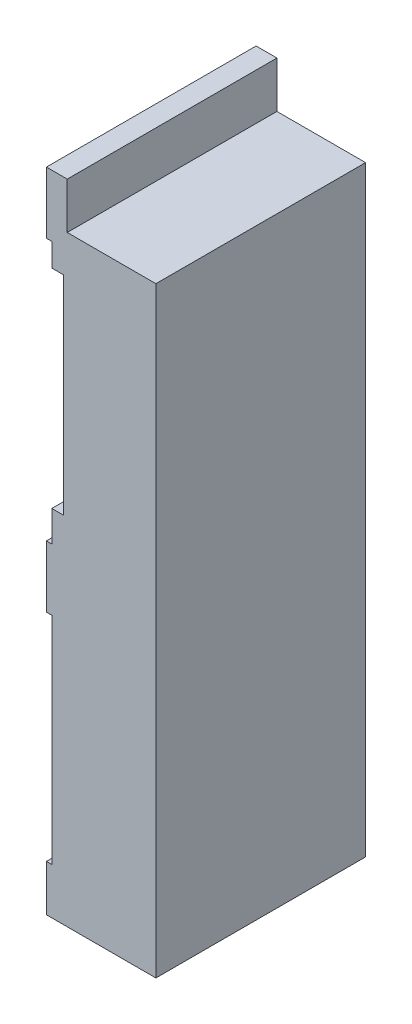
ISO-10303-21;
HEADER;
FILE_DESCRIPTION(('STEP AP214'),'2;1');
FILE_NAME('part.step','',(''),(''),'','','');
FILE_SCHEMA(('AUTOMOTIVE_DESIGN { 1 0 10303 214 1 1 1 1 }'));
ENDSEC;
DATA;
#1=APPLICATION_CONTEXT('core data for automotive mechanical design processes');
#2=APPLICATION_PROTOCOL_DEFINITION('international standard','automotive_design',2000,#1);
#3=PRODUCT_CONTEXT('',#1,'mechanical');
#4=PRODUCT('Part','Part','',(#3));
#5=PRODUCT_RELATED_PRODUCT_CATEGORY('part','',(#4));
#6=PRODUCT_DEFINITION_FORMATION('','',#4);
#7=PRODUCT_DEFINITION_CONTEXT('part definition',#1,'design');
#8=PRODUCT_DEFINITION('design','',#6,#7);
#9=PRODUCT_DEFINITION_SHAPE('','',#8);
#10=(LENGTH_UNIT() NAMED_UNIT(*) SI_UNIT(.MILLI.,.METRE.));
#11=(NAMED_UNIT(*) PLANE_ANGLE_UNIT() SI_UNIT($,.RADIAN.));
#12=(NAMED_UNIT(*) SI_UNIT($,.STERADIAN.) SOLID_ANGLE_UNIT());
#13=UNCERTAINTY_MEASURE_WITH_UNIT(LENGTH_MEASURE(1.E-05),#10,'distance_accuracy_value','');
#14=(GEOMETRIC_REPRESENTATION_CONTEXT(3) GLOBAL_UNCERTAINTY_ASSIGNED_CONTEXT((#13)) GLOBAL_UNIT_ASSIGNED_CONTEXT((#10,
#11,#12)) REPRESENTATION_CONTEXT('',''));
#15=CARTESIAN_POINT('',(0.,0.,0.));
#16=DIRECTION('',(0.,0.,1.));
#17=DIRECTION('',(1.,0.,0.));
#18=AXIS2_PLACEMENT_3D('',#15,#16,#17);
#19=CARTESIAN_POINT('',(10.2,32.,13.6));
#20=DIRECTION('',(1.,0.,0.));
#21=DIRECTION('',(0.,0.,-1.));
#22=AXIS2_PLACEMENT_3D('',#19,#20,#21);
#23=PLANE('',#22);
#24=DIRECTION('',(0.,-1.,0.));
#25=VECTOR('',#24,1.);
#26=CARTESIAN_POINT('',(10.2,32.,3.8));
#27=LINE('',#26,#25);
#28=CARTESIAN_POINT('',(10.2,18.,3.8));
#29=VERTEX_POINT('',#28);
#30=CARTESIAN_POINT('',(10.2,15.,3.8));
#31=VERTEX_POINT('',#30);
#32=EDGE_CURVE('E504',#29,#31,#27,.T.);
#33=ORIENTED_EDGE('',*,*,#32,.T.);
#34=DIRECTION('',(0.,0.,1.));
#35=VECTOR('',#34,1.);
#36=CARTESIAN_POINT('',(10.2,15.,13.6));
#37=LINE('',#36,#35);
#38=CARTESIAN_POINT('',(10.2,15.,9.8));
#39=VERTEX_POINT('',#38);
#40=EDGE_CURVE('E307',#31,#39,#37,.T.);
#41=ORIENTED_EDGE('',*,*,#40,.T.);
#42=DIRECTION('',(0.,-1.,0.));
#43=VECTOR('',#42,1.);
#44=CARTESIAN_POINT('',(10.2,32.,9.8));
#45=LINE('',#44,#43);
#46=CARTESIAN_POINT('',(10.2,18.,9.8));
#47=VERTEX_POINT('',#46);
#48=EDGE_CURVE('E46',#47,#39,#45,.T.);
#49=ORIENTED_EDGE('',*,*,#48,.F.);
#50=DIRECTION('',(0.,0.,-1.));
#51=VECTOR('',#50,1.);
#52=CARTESIAN_POINT('',(10.2,18.,13.6));
#53=LINE('',#52,#51);
#54=CARTESIAN_POINT('',(10.2,18.,13.6));
#55=VERTEX_POINT('',#54);
#56=EDGE_CURVE('E299',#55,#47,#53,.T.);
#57=ORIENTED_EDGE('',*,*,#56,.F.);
#58=DIRECTION('',(0.,-1.,0.));
#59=VECTOR('',#58,1.);
#60=CARTESIAN_POINT('',(10.2,32.,13.6));
#61=LINE('',#60,#59);
#62=CARTESIAN_POINT('',(10.2,32.,13.6));
#63=VERTEX_POINT('',#62);
#64=EDGE_CURVE('E392',#63,#55,#61,.T.);
#65=ORIENTED_EDGE('',*,*,#64,.F.);
#66=DIRECTION('',(0.,0.,-1.));
#67=VECTOR('',#66,1.);
#68=CARTESIAN_POINT('',(10.2,32.,13.6));
#69=LINE('',#68,#67);
#70=CARTESIAN_POINT('',(10.2,32.,9.8));
#71=VERTEX_POINT('',#70);
#72=EDGE_CURVE('E453',#63,#71,#69,.T.);
#73=ORIENTED_EDGE('',*,*,#72,.T.);
#74=DIRECTION('',(0.,-1.,0.));
#75=VECTOR('',#74,1.);
#76=CARTESIAN_POINT('',(10.2,32.,9.8));
#77=LINE('',#76,#75);
#78=CARTESIAN_POINT('',(10.2,31.,9.8));
#79=VERTEX_POINT('',#78);
#80=EDGE_CURVE('E348',#71,#79,#77,.T.);
#81=ORIENTED_EDGE('',*,*,#80,.T.);
#82=DIRECTION('',(0.,0.,-1.));
#83=VECTOR('',#82,1.);
#84=CARTESIAN_POINT('',(10.2,31.,13.6));
#85=LINE('',#84,#83);
#86=CARTESIAN_POINT('',(10.2,31.,3.8));
#87=VERTEX_POINT('',#86);
#88=EDGE_CURVE('E498',#79,#87,#85,.T.);
#89=ORIENTED_EDGE('',*,*,#88,.T.);
#90=DIRECTION('',(0.,-1.,0.));
#91=VECTOR('',#90,1.);
#92=CARTESIAN_POINT('',(10.2,32.,3.8));
#93=LINE('',#92,#91);
#94=CARTESIAN_POINT('',(10.2,32.,3.8));
#95=VERTEX_POINT('',#94);
#96=EDGE_CURVE('E357',#95,#87,#93,.T.);
#97=ORIENTED_EDGE('',*,*,#96,.F.);
#98=CARTESIAN_POINT('',(10.2,32.,0.));
#99=VERTEX_POINT('',#98);
#100=EDGE_CURVE('E421',#95,#99,#69,.T.);
#101=ORIENTED_EDGE('',*,*,#100,.T.);
#102=DIRECTION('',(0.,-1.,0.));
#103=VECTOR('',#102,1.);
#104=CARTESIAN_POINT('',(10.2,32.,0.));
#105=LINE('',#104,#103);
#106=CARTESIAN_POINT('',(10.2,18.,0.));
#107=VERTEX_POINT('',#106);
#108=EDGE_CURVE('E391',#99,#107,#105,.T.);
#109=ORIENTED_EDGE('',*,*,#108,.T.);
#110=DIRECTION('',(0.,0.,-1.));
#111=VECTOR('',#110,1.);
#112=CARTESIAN_POINT('',(10.2,18.,13.6));
#113=LINE('',#112,#111);
#114=EDGE_CURVE('E318',#29,#107,#113,.T.);
#115=ORIENTED_EDGE('',*,*,#114,.F.);
#116=EDGE_LOOP('',(#33,#41,#49,#57,#65,#73,#81,#89,#97,#101,#109,#115));
#117=FACE_BOUND('',#116,.T.);
#118=ADVANCED_FACE('F39',(#117),#23,.F.);
#119=CARTESIAN_POINT('',(10.2,38.,13.6));
#120=DIRECTION('',(1.,0.,0.));
#121=DIRECTION('',(0.,0.,-1.));
#122=AXIS2_PLACEMENT_3D('',#119,#120,#121);
#123=PLANE('',#122);
#124=DIRECTION('',(0.,-1.,0.));
#125=VECTOR('',#124,1.);
#126=CARTESIAN_POINT('',(10.2,38.,3.8));
#127=LINE('',#126,#125);
#128=CARTESIAN_POINT('',(10.2,36.2,3.8));
#129=VERTEX_POINT('',#128);
#130=CARTESIAN_POINT('',(10.2,36.,3.8));
#131=VERTEX_POINT('',#130);
#132=EDGE_CURVE('E359',#129,#131,#127,.T.);
#133=ORIENTED_EDGE('',*,*,#132,.F.);
#134=DIRECTION('',(0.,0.,1.));
#135=VECTOR('',#134,1.);
#136=CARTESIAN_POINT('',(10.2,36.2,13.6));
#137=LINE('',#136,#135);
#138=CARTESIAN_POINT('',(10.2,36.2,9.8));
#139=VERTEX_POINT('',#138);
#140=EDGE_CURVE('E501',#129,#139,#137,.T.);
#141=ORIENTED_EDGE('',*,*,#140,.T.);
#142=DIRECTION('',(0.,-1.,0.));
#143=VECTOR('',#142,1.);
#144=CARTESIAN_POINT('',(10.2,38.,9.8));
#145=LINE('',#144,#143);
#146=CARTESIAN_POINT('',(10.2,36.,9.8));
#147=VERTEX_POINT('',#146);
#148=EDGE_CURVE('E351',#139,#147,#145,.T.);
#149=ORIENTED_EDGE('',*,*,#148,.T.);
#150=DIRECTION('',(0.,0.,-1.));
#151=VECTOR('',#150,1.);
#152=CARTESIAN_POINT('',(10.2,36.,13.6));
#153=LINE('',#152,#151);
#154=CARTESIAN_POINT('',(10.2,36.,13.6));
#155=VERTEX_POINT('',#154);
#156=EDGE_CURVE('E457',#155,#147,#153,.T.);
#157=ORIENTED_EDGE('',*,*,#156,.F.);
#158=DIRECTION('',(0.,-1.,0.));
#159=VECTOR('',#158,1.);
#160=CARTESIAN_POINT('',(10.2,38.,13.6));
#161=LINE('',#160,#159);
#162=CARTESIAN_POINT('',(10.2,38.,13.6));
#163=VERTEX_POINT('',#162);
#164=EDGE_CURVE('E414',#163,#155,#161,.T.);
#165=ORIENTED_EDGE('',*,*,#164,.F.);
#166=DIRECTION('',(0.,0.,-1.));
#167=VECTOR('',#166,1.);
#168=CARTESIAN_POINT('',(10.2,38.,13.6));
#169=LINE('',#168,#167);
#170=CARTESIAN_POINT('',(10.2,38.,9.6));
#171=VERTEX_POINT('',#170);
#172=EDGE_CURVE('E461',#163,#171,#169,.T.);
#173=ORIENTED_EDGE('',*,*,#172,.T.);
#174=DIRECTION('',(0.,-1.,0.));
#175=VECTOR('',#174,1.);
#176=CARTESIAN_POINT('',(10.2,38.,9.6));
#177=LINE('',#176,#175);
#178=CARTESIAN_POINT('',(10.2,37.5,9.6));
#179=VERTEX_POINT('',#178);
#180=EDGE_CURVE('E486',#171,#179,#177,.T.);
#181=ORIENTED_EDGE('',*,*,#180,.T.);
#182=DIRECTION('',(0.,0.,-1.));
#183=VECTOR('',#182,1.);
#184=CARTESIAN_POINT('',(10.2,37.5,13.6));
#185=LINE('',#184,#183);
#186=CARTESIAN_POINT('',(10.2,37.5,4.));
#187=VERTEX_POINT('',#186);
#188=EDGE_CURVE('E489',#179,#187,#185,.T.);
#189=ORIENTED_EDGE('',*,*,#188,.T.);
#190=DIRECTION('',(0.,-1.,0.));
#191=VECTOR('',#190,1.);
#192=CARTESIAN_POINT('',(10.2,38.,4.));
#193=LINE('',#192,#191);
#194=CARTESIAN_POINT('',(10.2,38.,4.));
#195=VERTEX_POINT('',#194);
#196=EDGE_CURVE('E492',#195,#187,#193,.T.);
#197=ORIENTED_EDGE('',*,*,#196,.F.);
#198=CARTESIAN_POINT('',(10.2,38.,0.));
#199=VERTEX_POINT('',#198);
#200=EDGE_CURVE('E460',#195,#199,#169,.T.);
#201=ORIENTED_EDGE('',*,*,#200,.T.);
#202=DIRECTION('',(0.,-1.,0.));
#203=VECTOR('',#202,1.);
#204=CARTESIAN_POINT('',(10.2,38.,0.));
#205=LINE('',#204,#203);
#206=CARTESIAN_POINT('',(10.2,36.,0.));
#207=VERTEX_POINT('',#206);
#208=EDGE_CURVE('E446',#199,#207,#205,.T.);
#209=ORIENTED_EDGE('',*,*,#208,.T.);
#210=EDGE_CURVE('E456',#131,#207,#153,.T.);
#211=ORIENTED_EDGE('',*,*,#210,.F.);
#212=EDGE_LOOP('',(#133,#141,#149,#157,#165,#173,#181,#189,#197,#201,#209,#211));
#213=FACE_BOUND('',#212,.T.);
#214=ADVANCED_FACE('F581',(#213),#123,.F.);
#215=CARTESIAN_POINT('',(10.2,36.,13.6));
#216=DIRECTION('',(0.,-1.,0.));
#217=DIRECTION('',(0.,0.,-1.));
#218=AXIS2_PLACEMENT_3D('',#215,#216,#217);
#219=PLANE('',#218);
#220=DIRECTION('',(-1.,0.,0.));
#221=VECTOR('',#220,1.);
#222=CARTESIAN_POINT('',(10.2,36.,0.));
#223=LINE('',#222,#221);
#224=CARTESIAN_POINT('',(9.85,36.,0.));
#225=VERTEX_POINT('',#224);
#226=EDGE_CURVE('E449',#207,#225,#223,.T.);
#227=ORIENTED_EDGE('',*,*,#226,.T.);
#228=DIRECTION('',(0.,0.,1.));
#229=VECTOR('',#228,1.);
#230=CARTESIAN_POINT('',(9.85,36.,13.6));
#231=LINE('',#230,#229);
#232=CARTESIAN_POINT('',(9.85,36.,3.8));
#233=VERTEX_POINT('',#232);
#234=EDGE_CURVE('E539',#225,#233,#231,.T.);
#235=ORIENTED_EDGE('',*,*,#234,.T.);
#236=DIRECTION('',(-1.,0.,0.));
#237=VECTOR('',#236,1.);
#238=CARTESIAN_POINT('',(10.2,36.,3.8));
#239=LINE('',#238,#237);
#240=EDGE_CURVE('E354',#131,#233,#239,.T.);
#241=ORIENTED_EDGE('',*,*,#240,.F.);
#242=ORIENTED_EDGE('',*,*,#210,.T.);
#243=EDGE_LOOP('',(#227,#235,#241,#242));
#244=FACE_BOUND('',#243,.T.);
#245=ADVANCED_FACE('F576',(#244),#219,.F.);
#246=CARTESIAN_POINT('',(4.7,32.,13.6));
#247=DIRECTION('',(0.,1.,0.));
#248=DIRECTION('',(0.,0.,1.));
#249=AXIS2_PLACEMENT_3D('',#246,#247,#248);
#250=PLANE('',#249);
#251=DIRECTION('',(1.,0.,0.));
#252=VECTOR('',#251,1.);
#253=CARTESIAN_POINT('',(4.7,32.,3.8));
#254=LINE('',#253,#252);
#255=CARTESIAN_POINT('',(9.85,32.,3.8));
#256=VERTEX_POINT('',#255);
#257=EDGE_CURVE('E496',#256,#95,#254,.T.);
#258=ORIENTED_EDGE('',*,*,#257,.F.);
#259=DIRECTION('',(0.,0.,-1.));
#260=VECTOR('',#259,1.);
#261=CARTESIAN_POINT('',(9.85,32.,13.6));
#262=LINE('',#261,#260);
#263=CARTESIAN_POINT('',(9.85,32.,0.));
#264=VERTEX_POINT('',#263);
#265=EDGE_CURVE('E61',#256,#264,#262,.T.);
#266=ORIENTED_EDGE('',*,*,#265,.T.);
#267=DIRECTION('',(1.,0.,0.));
#268=VECTOR('',#267,1.);
#269=CARTESIAN_POINT('',(4.7,32.,0.));
#270=LINE('',#269,#268);
#271=EDGE_CURVE('E395',#264,#99,#270,.T.);
#272=ORIENTED_EDGE('',*,*,#271,.T.);
#273=ORIENTED_EDGE('',*,*,#100,.F.);
#274=EDGE_LOOP('',(#258,#266,#272,#273));
#275=FACE_BOUND('',#274,.T.);
#276=ADVANCED_FACE('F639',(#275),#250,.F.);
#277=CARTESIAN_POINT('',(10.95,51.5,13.6));
#278=DIRECTION('',(1.,0.,0.));
#279=DIRECTION('',(0.,0.,-1.));
#280=AXIS2_PLACEMENT_3D('',#277,#278,#279);
#281=PLANE('',#280);
#282=DIRECTION('',(0.,-1.,0.));
#283=VECTOR('',#282,1.);
#284=CARTESIAN_POINT('',(10.95,51.5,4.));
#285=LINE('',#284,#283);
#286=CARTESIAN_POINT('',(10.95,51.5,4.));
#287=VERTEX_POINT('',#286);
#288=CARTESIAN_POINT('',(10.95,38.,4.));
#289=VERTEX_POINT('',#288);
#290=EDGE_CURVE('E389',#287,#289,#285,.T.);
#291=ORIENTED_EDGE('',*,*,#290,.F.);
#292=DIRECTION('',(0.,0.,-1.));
#293=VECTOR('',#292,1.);
#294=CARTESIAN_POINT('',(10.95,51.5,13.6));
#295=LINE('',#294,#293);
#296=CARTESIAN_POINT('',(10.95,51.5,0.));
#297=VERTEX_POINT('',#296);
#298=EDGE_CURVE('E468',#287,#297,#295,.T.);
#299=ORIENTED_EDGE('',*,*,#298,.T.);
#300=DIRECTION('',(0.,-1.,0.));
#301=VECTOR('',#300,1.);
#302=CARTESIAN_POINT('',(10.95,51.5,0.));
#303=LINE('',#302,#301);
#304=CARTESIAN_POINT('',(10.95,38.,0.));
#305=VERTEX_POINT('',#304);
#306=EDGE_CURVE('E440',#297,#305,#303,.T.);
#307=ORIENTED_EDGE('',*,*,#306,.T.);
#308=DIRECTION('',(0.,0.,-1.));
#309=VECTOR('',#308,1.);
#310=CARTESIAN_POINT('',(10.95,38.,13.6));
#311=LINE('',#310,#309);
#312=EDGE_CURVE('E464',#289,#305,#311,.T.);
#313=ORIENTED_EDGE('',*,*,#312,.F.);
#314=EDGE_LOOP('',(#291,#299,#307,#313));
#315=FACE_BOUND('',#314,.T.);
#316=ADVANCED_FACE('F593',(#315),#281,.F.);
#317=CARTESIAN_POINT('',(10.95,38.,13.6));
#318=DIRECTION('',(0.,-1.,0.));
#319=DIRECTION('',(0.,0.,-1.));
#320=AXIS2_PLACEMENT_3D('',#317,#318,#319);
#321=PLANE('',#320);
#322=DIRECTION('',(-1.,0.,0.));
#323=VECTOR('',#322,1.);
#324=CARTESIAN_POINT('',(10.95,38.,4.));
#325=LINE('',#324,#323);
#326=EDGE_CURVE('E387',#289,#195,#325,.T.);
#327=ORIENTED_EDGE('',*,*,#326,.F.);
#328=ORIENTED_EDGE('',*,*,#312,.T.);
#329=DIRECTION('',(-1.,0.,0.));
#330=VECTOR('',#329,1.);
#331=CARTESIAN_POINT('',(10.95,38.,0.));
#332=LINE('',#331,#330);
#333=EDGE_CURVE('E443',#305,#199,#332,.T.);
#334=ORIENTED_EDGE('',*,*,#333,.T.);
#335=ORIENTED_EDGE('',*,*,#200,.F.);
#336=EDGE_LOOP('',(#327,#328,#334,#335));
#337=FACE_BOUND('',#336,.T.);
#338=ADVANCED_FACE('F589',(#337),#321,.F.);
#339=CARTESIAN_POINT('',(16.95,0.,13.6));
#340=DIRECTION('',(-1.,0.,0.));
#341=DIRECTION('',(0.,0.,1.));
#342=AXIS2_PLACEMENT_3D('',#339,#340,#341);
#343=PLANE('',#342);
#344=DIRECTION('',(0.,1.,0.));
#345=VECTOR('',#344,1.);
#346=CARTESIAN_POINT('',(16.95,0.,13.6));
#347=LINE('',#346,#345);
#348=CARTESIAN_POINT('',(16.95,15.,13.6));
#349=VERTEX_POINT('',#348);
#350=CARTESIAN_POINT('',(16.95,54.,13.6));
#351=VERTEX_POINT('',#350);
#352=EDGE_CURVE('E394',#349,#351,#347,.T.);
#353=ORIENTED_EDGE('',*,*,#352,.F.);
#354=DIRECTION('',(0.,0.,-1.));
#355=VECTOR('',#354,1.);
#356=CARTESIAN_POINT('',(16.95,15.,13.6));
#357=LINE('',#356,#355);
#358=CARTESIAN_POINT('',(16.95,15.,0.));
#359=VERTEX_POINT('',#358);
#360=EDGE_CURVE('E295',#349,#359,#357,.T.);
#361=ORIENTED_EDGE('',*,*,#360,.T.);
#362=DIRECTION('',(0.,1.,0.));
#363=VECTOR('',#362,1.);
#364=CARTESIAN_POINT('',(16.95,0.,0.));
#365=LINE('',#364,#363);
#366=CARTESIAN_POINT('',(16.95,54.,0.));
#367=VERTEX_POINT('',#366);
#368=EDGE_CURVE('E423',#359,#367,#365,.T.);
#369=ORIENTED_EDGE('',*,*,#368,.T.);
#370=DIRECTION('',(0.,0.,-1.));
#371=VECTOR('',#370,1.);
#372=CARTESIAN_POINT('',(16.95,54.,13.6));
#373=LINE('',#372,#371);
#374=EDGE_CURVE('E483',#351,#367,#373,.T.);
#375=ORIENTED_EDGE('',*,*,#374,.F.);
#376=EDGE_LOOP('',(#353,#361,#369,#375));
#377=FACE_BOUND('',#376,.T.);
#378=ADVANCED_FACE('F547',(#377),#343,.F.);
#379=CARTESIAN_POINT('',(16.95,54.,13.6));
#380=DIRECTION('',(0.,-1.,0.));
#381=DIRECTION('',(0.,0.,-1.));
#382=AXIS2_PLACEMENT_3D('',#379,#380,#381);
#383=PLANE('',#382);
#384=DIRECTION('',(-1.,0.,0.));
#385=VECTOR('',#384,1.);
#386=CARTESIAN_POINT('',(16.95,54.,0.));
#387=LINE('',#386,#385);
#388=CARTESIAN_POINT('',(11.2,54.,0.));
#389=VERTEX_POINT('',#388);
#390=EDGE_CURVE('E425',#367,#389,#387,.T.);
#391=ORIENTED_EDGE('',*,*,#390,.T.);
#392=DIRECTION('',(0.,0.,-1.));
#393=VECTOR('',#392,1.);
#394=CARTESIAN_POINT('',(11.2,54.,13.6));
#395=LINE('',#394,#393);
#396=CARTESIAN_POINT('',(11.2,54.,13.6));
#397=VERTEX_POINT('',#396);
#398=EDGE_CURVE('E480',#397,#389,#395,.T.);
#399=ORIENTED_EDGE('',*,*,#398,.F.);
#400=DIRECTION('',(-1.,0.,0.));
#401=VECTOR('',#400,1.);
#402=CARTESIAN_POINT('',(16.95,54.,13.6));
#403=LINE('',#402,#401);
#404=EDGE_CURVE('E397',#351,#397,#403,.T.);
#405=ORIENTED_EDGE('',*,*,#404,.F.);
#406=ORIENTED_EDGE('',*,*,#374,.T.);
#407=EDGE_LOOP('',(#391,#399,#405,#406));
#408=FACE_BOUND('',#407,.T.);
#409=ADVANCED_FACE('F557',(#408),#383,.F.);
#410=CARTESIAN_POINT('',(11.2,54.,13.6));
#411=DIRECTION('',(-1.,0.,0.));
#412=DIRECTION('',(0.,0.,1.));
#413=AXIS2_PLACEMENT_3D('',#410,#411,#412);
#414=PLANE('',#413);
#415=DIRECTION('',(0.,1.,0.));
#416=VECTOR('',#415,1.);
#417=CARTESIAN_POINT('',(11.2,54.,0.));
#418=LINE('',#417,#416);
#419=CARTESIAN_POINT('',(11.2,57.,0.));
#420=VERTEX_POINT('',#419);
#421=EDGE_CURVE('E427',#389,#420,#418,.T.);
#422=ORIENTED_EDGE('',*,*,#421,.T.);
#423=DIRECTION('',(0.,0.,-1.));
#424=VECTOR('',#423,1.);
#425=CARTESIAN_POINT('',(11.2,57.,13.6));
#426=LINE('',#425,#424);
#427=CARTESIAN_POINT('',(11.2,57.,13.6));
#428=VERTEX_POINT('',#427);
#429=EDGE_CURVE('E477',#428,#420,#426,.T.);
#430=ORIENTED_EDGE('',*,*,#429,.F.);
#431=DIRECTION('',(0.,1.,0.));
#432=VECTOR('',#431,1.);
#433=CARTESIAN_POINT('',(11.2,54.,13.6));
#434=LINE('',#433,#432);
#435=EDGE_CURVE('E399',#397,#428,#434,.T.);
#436=ORIENTED_EDGE('',*,*,#435,.F.);
#437=ORIENTED_EDGE('',*,*,#398,.T.);
#438=EDGE_LOOP('',(#422,#430,#436,#437));
#439=FACE_BOUND('',#438,.T.);
#440=ADVANCED_FACE('F561',(#439),#414,.F.);
#441=CARTESIAN_POINT('',(11.2,57.,13.6));
#442=DIRECTION('',(0.,-1.,0.));
#443=DIRECTION('',(0.,0.,-1.));
#444=AXIS2_PLACEMENT_3D('',#441,#442,#443);
#445=PLANE('',#444);
#446=DIRECTION('',(-1.,0.,0.));
#447=VECTOR('',#446,1.);
#448=CARTESIAN_POINT('',(11.2,57.,0.));
#449=LINE('',#448,#447);
#450=CARTESIAN_POINT('',(9.85,57.,0.));
#451=VERTEX_POINT('',#450);
#452=EDGE_CURVE('E429',#420,#451,#449,.T.);
#453=ORIENTED_EDGE('',*,*,#452,.T.);
#454=DIRECTION('',(0.,0.,1.));
#455=VECTOR('',#454,1.);
#456=CARTESIAN_POINT('',(9.85,57.,13.6));
#457=LINE('',#456,#455);
#458=CARTESIAN_POINT('',(9.85,57.,13.6));
#459=VERTEX_POINT('',#458);
#460=EDGE_CURVE('E53',#451,#459,#457,.T.);
#461=ORIENTED_EDGE('',*,*,#460,.T.);
#462=DIRECTION('',(-1.,0.,0.));
#463=VECTOR('',#462,1.);
#464=CARTESIAN_POINT('',(11.2,57.,13.6));
#465=LINE('',#464,#463);
#466=EDGE_CURVE('E401',#428,#459,#465,.T.);
#467=ORIENTED_EDGE('',*,*,#466,.F.);
#468=ORIENTED_EDGE('',*,*,#429,.T.);
#469=EDGE_LOOP('',(#453,#461,#467,#468));
#470=FACE_BOUND('',#469,.T.);
#471=ADVANCED_FACE('F567',(#470),#445,.F.);
#472=CARTESIAN_POINT('',(4.7,53.,13.6));
#473=DIRECTION('',(0.,1.,0.));
#474=DIRECTION('',(0.,0.,1.));
#475=AXIS2_PLACEMENT_3D('',#472,#473,#474);
#476=PLANE('',#475);
#477=DIRECTION('',(1.,0.,0.));
#478=VECTOR('',#477,1.);
#479=CARTESIAN_POINT('',(4.7,53.,13.6));
#480=LINE('',#479,#478);
#481=CARTESIAN_POINT('',(9.85,53.,13.6));
#482=VERTEX_POINT('',#481);
#483=CARTESIAN_POINT('',(10.2,53.,13.6));
#484=VERTEX_POINT('',#483);
#485=EDGE_CURVE('E404',#482,#484,#480,.T.);
#486=ORIENTED_EDGE('',*,*,#485,.F.);
#487=DIRECTION('',(0.,0.,-1.));
#488=VECTOR('',#487,1.);
#489=CARTESIAN_POINT('',(9.85,53.,13.6));
#490=LINE('',#489,#488);
#491=CARTESIAN_POINT('',(9.85,53.,0.));
#492=VERTEX_POINT('',#491);
#493=EDGE_CURVE('E542',#482,#492,#490,.T.);
#494=ORIENTED_EDGE('',*,*,#493,.T.);
#495=DIRECTION('',(1.,0.,0.));
#496=VECTOR('',#495,1.);
#497=CARTESIAN_POINT('',(4.7,53.,0.));
#498=LINE('',#497,#496);
#499=CARTESIAN_POINT('',(10.2,53.,0.));
#500=VERTEX_POINT('',#499);
#501=EDGE_CURVE('E432',#492,#500,#498,.T.);
#502=ORIENTED_EDGE('',*,*,#501,.T.);
#503=DIRECTION('',(0.,0.,-1.));
#504=VECTOR('',#503,1.);
#505=CARTESIAN_POINT('',(10.2,53.,13.6));
#506=LINE('',#505,#504);
#507=EDGE_CURVE('E474',#484,#500,#506,.T.);
#508=ORIENTED_EDGE('',*,*,#507,.F.);
#509=EDGE_LOOP('',(#486,#494,#502,#508));
#510=FACE_BOUND('',#509,.T.);
#511=ADVANCED_FACE('F605',(#510),#476,.F.);
#512=CARTESIAN_POINT('',(10.2,53.,13.6));
#513=DIRECTION('',(1.,0.,0.));
#514=DIRECTION('',(0.,0.,-1.));
#515=AXIS2_PLACEMENT_3D('',#512,#513,#514);
#516=PLANE('',#515);
#517=DIRECTION('',(0.,-1.,0.));
#518=VECTOR('',#517,1.);
#519=CARTESIAN_POINT('',(10.2,53.,0.));
#520=LINE('',#519,#518);
#521=CARTESIAN_POINT('',(10.2,51.5,0.));
#522=VERTEX_POINT('',#521);
#523=EDGE_CURVE('E434',#500,#522,#520,.T.);
#524=ORIENTED_EDGE('',*,*,#523,.T.);
#525=DIRECTION('',(0.,0.,-1.));
#526=VECTOR('',#525,1.);
#527=CARTESIAN_POINT('',(10.2,51.5,13.6));
#528=LINE('',#527,#526);
#529=CARTESIAN_POINT('',(10.2,51.5,13.6));
#530=VERTEX_POINT('',#529);
#531=EDGE_CURVE('E472',#530,#522,#528,.T.);
#532=ORIENTED_EDGE('',*,*,#531,.F.);
#533=DIRECTION('',(0.,-1.,0.));
#534=VECTOR('',#533,1.);
#535=CARTESIAN_POINT('',(10.2,53.,13.6));
#536=LINE('',#535,#534);
#537=EDGE_CURVE('E406',#484,#530,#536,.T.);
#538=ORIENTED_EDGE('',*,*,#537,.F.);
#539=ORIENTED_EDGE('',*,*,#507,.T.);
#540=EDGE_LOOP('',(#524,#532,#538,#539));
#541=FACE_BOUND('',#540,.T.);
#542=ADVANCED_FACE('F601',(#541),#516,.F.);
#543=CARTESIAN_POINT('',(10.2,51.5,13.6));
#544=DIRECTION('',(0.,1.,0.));
#545=DIRECTION('',(0.,0.,1.));
#546=AXIS2_PLACEMENT_3D('',#543,#544,#545);
#547=PLANE('',#546);
#548=ORIENTED_EDGE('',*,*,#531,.T.);
#549=DIRECTION('',(1.,0.,0.));
#550=VECTOR('',#549,1.);
#551=CARTESIAN_POINT('',(10.2,51.5,0.));
#552=LINE('',#551,#550);
#553=EDGE_CURVE('E437',#522,#297,#552,.T.);
#554=ORIENTED_EDGE('',*,*,#553,.T.);
#555=ORIENTED_EDGE('',*,*,#298,.F.);
#556=DIRECTION('',(-1.,0.,0.));
#557=VECTOR('',#556,1.);
#558=CARTESIAN_POINT('',(15.4,51.5,4.));
#559=LINE('',#558,#557);
#560=CARTESIAN_POINT('',(15.4,51.5,4.));
#561=VERTEX_POINT('',#560);
#562=EDGE_CURVE('E368',#561,#287,#559,.T.);
#563=ORIENTED_EDGE('',*,*,#562,.F.);
#564=DIRECTION('',(0.,0.,1.));
#565=VECTOR('',#564,1.);
#566=CARTESIAN_POINT('',(15.4,51.5,4.));
#567=LINE('',#566,#565);
#568=CARTESIAN_POINT('',(15.4,51.5,9.6));
#569=VERTEX_POINT('',#568);
#570=EDGE_CURVE('E377',#561,#569,#567,.T.);
#571=ORIENTED_EDGE('',*,*,#570,.T.);
#572=DIRECTION('',(-1.,0.,0.));
#573=VECTOR('',#572,1.);
#574=CARTESIAN_POINT('',(15.4,51.5,9.6));
#575=LINE('',#574,#573);
#576=CARTESIAN_POINT('',(10.95,51.5,9.6));
#577=VERTEX_POINT('',#576);
#578=EDGE_CURVE('E365',#569,#577,#575,.T.);
#579=ORIENTED_EDGE('',*,*,#578,.T.);
#580=CARTESIAN_POINT('',(10.95,51.5,13.6));
#581=VERTEX_POINT('',#580);
#582=EDGE_CURVE('E469',#581,#577,#295,.T.);
#583=ORIENTED_EDGE('',*,*,#582,.F.);
#584=DIRECTION('',(1.,0.,0.));
#585=VECTOR('',#584,1.);
#586=CARTESIAN_POINT('',(10.2,51.5,13.6));
#587=LINE('',#586,#585);
#588=EDGE_CURVE('E408',#530,#581,#587,.T.);
#589=ORIENTED_EDGE('',*,*,#588,.F.);
#590=EDGE_LOOP('',(#548,#554,#555,#563,#571,#579,#583,#589));
#591=FACE_BOUND('',#590,.T.);
#592=ADVANCED_FACE('F597',(#591),#547,.F.);
#593=ORIENTED_EDGE('',*,*,#582,.T.);
#594=DIRECTION('',(0.,-1.,0.));
#595=VECTOR('',#594,1.);
#596=CARTESIAN_POINT('',(10.95,51.5,9.6));
#597=LINE('',#596,#595);
#598=CARTESIAN_POINT('',(10.95,38.,9.6));
#599=VERTEX_POINT('',#598);
#600=EDGE_CURVE('E384',#577,#599,#597,.T.);
#601=ORIENTED_EDGE('',*,*,#600,.T.);
#602=CARTESIAN_POINT('',(10.95,38.,13.6));
#603=VERTEX_POINT('',#602);
#604=EDGE_CURVE('E465',#603,#599,#311,.T.);
#605=ORIENTED_EDGE('',*,*,#604,.F.);
#606=DIRECTION('',(0.,-1.,0.));
#607=VECTOR('',#606,1.);
#608=CARTESIAN_POINT('',(10.95,51.5,13.6));
#609=LINE('',#608,#607);
#610=EDGE_CURVE('E410',#581,#603,#609,.T.);
#611=ORIENTED_EDGE('',*,*,#610,.F.);
#612=EDGE_LOOP('',(#593,#601,#605,#611));
#613=FACE_BOUND('',#612,.T.);
#614=ADVANCED_FACE('F661',(#613),#281,.F.);
#615=ORIENTED_EDGE('',*,*,#604,.T.);
#616=DIRECTION('',(-1.,0.,0.));
#617=VECTOR('',#616,1.);
#618=CARTESIAN_POINT('',(10.95,38.,9.6));
#619=LINE('',#618,#617);
#620=EDGE_CURVE('E379',#599,#171,#619,.T.);
#621=ORIENTED_EDGE('',*,*,#620,.T.);
#622=ORIENTED_EDGE('',*,*,#172,.F.);
#623=DIRECTION('',(-1.,0.,0.));
#624=VECTOR('',#623,1.);
#625=CARTESIAN_POINT('',(10.95,38.,13.6));
#626=LINE('',#625,#624);
#627=EDGE_CURVE('E412',#603,#163,#626,.T.);
#628=ORIENTED_EDGE('',*,*,#627,.F.);
#629=EDGE_LOOP('',(#615,#621,#622,#628));
#630=FACE_BOUND('',#629,.T.);
#631=ADVANCED_FACE('F645',(#630),#321,.F.);
#632=DIRECTION('',(-1.,0.,0.));
#633=VECTOR('',#632,1.);
#634=CARTESIAN_POINT('',(10.2,36.,9.8));
#635=LINE('',#634,#633);
#636=CARTESIAN_POINT('',(9.85,36.,9.8));
#637=VERTEX_POINT('',#636);
#638=EDGE_CURVE('E343',#147,#637,#635,.T.);
#639=ORIENTED_EDGE('',*,*,#638,.T.);
#640=DIRECTION('',(0.,0.,1.));
#641=VECTOR('',#640,1.);
#642=CARTESIAN_POINT('',(9.85,36.,13.6));
#643=LINE('',#642,#641);
#644=CARTESIAN_POINT('',(9.85,36.,13.6));
#645=VERTEX_POINT('',#644);
#646=EDGE_CURVE('E533',#637,#645,#643,.T.);
#647=ORIENTED_EDGE('',*,*,#646,.T.);
#648=DIRECTION('',(-1.,0.,0.));
#649=VECTOR('',#648,1.);
#650=CARTESIAN_POINT('',(10.2,36.,13.6));
#651=LINE('',#650,#649);
#652=EDGE_CURVE('E416',#155,#645,#651,.T.);
#653=ORIENTED_EDGE('',*,*,#652,.F.);
#654=ORIENTED_EDGE('',*,*,#156,.T.);
#655=EDGE_LOOP('',(#639,#647,#653,#654));
#656=FACE_BOUND('',#655,.T.);
#657=ADVANCED_FACE('F613',(#656),#219,.F.);
#658=DIRECTION('',(1.,0.,0.));
#659=VECTOR('',#658,1.);
#660=CARTESIAN_POINT('',(4.7,32.,13.6));
#661=LINE('',#660,#659);
#662=CARTESIAN_POINT('',(9.85,32.,13.6));
#663=VERTEX_POINT('',#662);
#664=EDGE_CURVE('E419',#663,#63,#661,.T.);
#665=ORIENTED_EDGE('',*,*,#664,.F.);
#666=DIRECTION('',(0.,0.,-1.));
#667=VECTOR('',#666,1.);
#668=CARTESIAN_POINT('',(9.85,32.,13.6));
#669=LINE('',#668,#667);
#670=CARTESIAN_POINT('',(9.85,32.,9.8));
#671=VERTEX_POINT('',#670);
#672=EDGE_CURVE('E530',#663,#671,#669,.T.);
#673=ORIENTED_EDGE('',*,*,#672,.T.);
#674=DIRECTION('',(1.,0.,0.));
#675=VECTOR('',#674,1.);
#676=CARTESIAN_POINT('',(4.7,32.,9.8));
#677=LINE('',#676,#675);
#678=EDGE_CURVE('E494',#671,#71,#677,.T.);
#679=ORIENTED_EDGE('',*,*,#678,.T.);
#680=ORIENTED_EDGE('',*,*,#72,.F.);
#681=EDGE_LOOP('',(#665,#673,#679,#680));
#682=FACE_BOUND('',#681,.T.);
#683=ADVANCED_FACE('F636',(#682),#250,.F.);
#684=CARTESIAN_POINT('',(0.,0.,13.6));
#685=DIRECTION('',(0.,0.,1.));
#686=DIRECTION('',(1.,0.,0.));
#687=AXIS2_PLACEMENT_3D('',#684,#685,#686);
#688=PLANE('',#687);
#689=DIRECTION('',(0.,1.,0.));
#690=VECTOR('',#689,1.);
#691=CARTESIAN_POINT('',(9.85,13.,13.6));
#692=LINE('',#691,#690);
#693=CARTESIAN_POINT('',(9.85,15.,13.6));
#694=VERTEX_POINT('',#693);
#695=CARTESIAN_POINT('',(9.85,18.,13.6));
#696=VERTEX_POINT('',#695);
#697=EDGE_CURVE('E273',#694,#696,#692,.T.);
#698=ORIENTED_EDGE('',*,*,#697,.F.);
#699=DIRECTION('',(1.,0.,0.));
#700=VECTOR('',#699,1.);
#701=CARTESIAN_POINT('',(7.5,15.,13.6));
#702=LINE('',#701,#700);
#703=EDGE_CURVE('E285',#694,#349,#702,.T.);
#704=ORIENTED_EDGE('',*,*,#703,.T.);
#705=ORIENTED_EDGE('',*,*,#352,.T.);
#706=ORIENTED_EDGE('',*,*,#404,.T.);
#707=ORIENTED_EDGE('',*,*,#435,.T.);
#708=ORIENTED_EDGE('',*,*,#466,.T.);
#709=EDGE_CURVE('E292',#482,#459,#692,.T.);
#710=ORIENTED_EDGE('',*,*,#709,.F.);
#711=ORIENTED_EDGE('',*,*,#485,.T.);
#712=ORIENTED_EDGE('',*,*,#537,.T.);
#713=ORIENTED_EDGE('',*,*,#588,.T.);
#714=ORIENTED_EDGE('',*,*,#610,.T.);
#715=ORIENTED_EDGE('',*,*,#627,.T.);
#716=ORIENTED_EDGE('',*,*,#164,.T.);
#717=ORIENTED_EDGE('',*,*,#652,.T.);
#718=EDGE_CURVE('E290',#663,#645,#692,.T.);
#719=ORIENTED_EDGE('',*,*,#718,.F.);
#720=ORIENTED_EDGE('',*,*,#664,.T.);
#721=ORIENTED_EDGE('',*,*,#64,.T.);
#722=DIRECTION('',(-1.,0.,0.));
#723=VECTOR('',#722,1.);
#724=CARTESIAN_POINT('',(11.2,18.,13.6));
#725=LINE('',#724,#723);
#726=EDGE_CURVE('E289',#55,#696,#725,.T.);
#727=ORIENTED_EDGE('',*,*,#726,.T.);
#728=EDGE_LOOP('',(#698,#704,#705,#706,#707,#708,#710,#711,#712,#713,#714,#715,#716,#717,#719,
#720,#721,#727));
#729=FACE_BOUND('',#728,.T.);
#730=ADVANCED_FACE('F284',(#729),#688,.T.);
#731=CARTESIAN_POINT('',(0.,0.,0.));
#732=DIRECTION('',(0.,0.,1.));
#733=DIRECTION('',(1.,0.,0.));
#734=AXIS2_PLACEMENT_3D('',#731,#732,#733);
#735=PLANE('',#734);
#736=DIRECTION('',(1.,0.,0.));
#737=VECTOR('',#736,1.);
#738=CARTESIAN_POINT('',(7.5,15.,0.));
#739=LINE('',#738,#737);
#740=CARTESIAN_POINT('',(9.85,15.,0.));
#741=VERTEX_POINT('',#740);
#742=EDGE_CURVE('E311',#741,#359,#739,.T.);
#743=ORIENTED_EDGE('',*,*,#742,.F.);
#744=DIRECTION('',(0.,1.,0.));
#745=VECTOR('',#744,1.);
#746=CARTESIAN_POINT('',(9.85,0.,0.));
#747=LINE('',#746,#745);
#748=CARTESIAN_POINT('',(9.85,18.,0.));
#749=VERTEX_POINT('',#748);
#750=EDGE_CURVE('E522',#741,#749,#747,.T.);
#751=ORIENTED_EDGE('',*,*,#750,.T.);
#752=DIRECTION('',(-1.,0.,0.));
#753=VECTOR('',#752,1.);
#754=CARTESIAN_POINT('',(11.2,18.,0.));
#755=LINE('',#754,#753);
#756=EDGE_CURVE('E315',#107,#749,#755,.T.);
#757=ORIENTED_EDGE('',*,*,#756,.F.);
#758=ORIENTED_EDGE('',*,*,#108,.F.);
#759=ORIENTED_EDGE('',*,*,#271,.F.);
#760=EDGE_CURVE('E526',#264,#225,#747,.T.);
#761=ORIENTED_EDGE('',*,*,#760,.T.);
#762=ORIENTED_EDGE('',*,*,#226,.F.);
#763=ORIENTED_EDGE('',*,*,#208,.F.);
#764=ORIENTED_EDGE('',*,*,#333,.F.);
#765=ORIENTED_EDGE('',*,*,#306,.F.);
#766=ORIENTED_EDGE('',*,*,#553,.F.);
#767=ORIENTED_EDGE('',*,*,#523,.F.);
#768=ORIENTED_EDGE('',*,*,#501,.F.);
#769=EDGE_CURVE('E525',#492,#451,#747,.T.);
#770=ORIENTED_EDGE('',*,*,#769,.T.);
#771=ORIENTED_EDGE('',*,*,#452,.F.);
#772=ORIENTED_EDGE('',*,*,#421,.F.);
#773=ORIENTED_EDGE('',*,*,#390,.F.);
#774=ORIENTED_EDGE('',*,*,#368,.F.);
#775=EDGE_LOOP('',(#743,#751,#757,#758,#759,#761,#762,#763,#764,#765,#766,#767,#768,#770,#771,
#772,#773,#774));
#776=FACE_BOUND('',#775,.T.);
#777=ADVANCED_FACE('F552',(#776),#735,.F.);
#778=CARTESIAN_POINT('',(7.,37.5,4.));
#779=DIRECTION('',(0.,-1.,0.));
#780=DIRECTION('',(0.,0.,-1.));
#781=AXIS2_PLACEMENT_3D('',#778,#779,#780);
#782=PLANE('',#781);
#783=DIRECTION('',(1.,0.,0.));
#784=VECTOR('',#783,1.);
#785=CARTESIAN_POINT('',(7.,37.5,9.6));
#786=LINE('',#785,#784);
#787=CARTESIAN_POINT('',(15.4,37.5,9.6));
#788=VERTEX_POINT('',#787);
#789=EDGE_CURVE('E361',#179,#788,#786,.T.);
#790=ORIENTED_EDGE('',*,*,#789,.T.);
#791=DIRECTION('',(0.,0.,1.));
#792=VECTOR('',#791,1.);
#793=CARTESIAN_POINT('',(15.4,37.5,4.));
#794=LINE('',#793,#792);
#795=CARTESIAN_POINT('',(15.4,37.5,4.));
#796=VERTEX_POINT('',#795);
#797=EDGE_CURVE('E370',#796,#788,#794,.T.);
#798=ORIENTED_EDGE('',*,*,#797,.F.);
#799=DIRECTION('',(1.,0.,0.));
#800=VECTOR('',#799,1.);
#801=CARTESIAN_POINT('',(7.,37.5,4.));
#802=LINE('',#801,#800);
#803=EDGE_CURVE('E362',#187,#796,#802,.T.);
#804=ORIENTED_EDGE('',*,*,#803,.F.);
#805=ORIENTED_EDGE('',*,*,#188,.F.);
#806=EDGE_LOOP('',(#790,#798,#804,#805));
#807=FACE_BOUND('',#806,.T.);
#808=ADVANCED_FACE('F782',(#807),#782,.F.);
#809=CARTESIAN_POINT('',(0.,0.,4.));
#810=DIRECTION('',(0.,0.,1.));
#811=DIRECTION('',(1.,0.,0.));
#812=AXIS2_PLACEMENT_3D('',#809,#810,#811);
#813=PLANE('',#812);
#814=ORIENTED_EDGE('',*,*,#290,.T.);
#815=ORIENTED_EDGE('',*,*,#326,.T.);
#816=ORIENTED_EDGE('',*,*,#196,.T.);
#817=ORIENTED_EDGE('',*,*,#803,.T.);
#818=DIRECTION('',(0.,1.,0.));
#819=VECTOR('',#818,1.);
#820=CARTESIAN_POINT('',(15.4,37.5,4.));
#821=LINE('',#820,#819);
#822=EDGE_CURVE('E364',#796,#561,#821,.T.);
#823=ORIENTED_EDGE('',*,*,#822,.T.);
#824=ORIENTED_EDGE('',*,*,#562,.T.);
#825=EDGE_LOOP('',(#814,#815,#816,#817,#823,#824));
#826=FACE_BOUND('',#825,.T.);
#827=ADVANCED_FACE('F771',(#826),#813,.T.);
#828=CARTESIAN_POINT('',(0.,0.,9.6));
#829=DIRECTION('',(0.,0.,1.));
#830=DIRECTION('',(1.,0.,0.));
#831=AXIS2_PLACEMENT_3D('',#828,#829,#830);
#832=PLANE('',#831);
#833=ORIENTED_EDGE('',*,*,#578,.F.);
#834=DIRECTION('',(0.,1.,0.));
#835=VECTOR('',#834,1.);
#836=CARTESIAN_POINT('',(15.4,37.5,9.6));
#837=LINE('',#836,#835);
#838=EDGE_CURVE('E372',#788,#569,#837,.T.);
#839=ORIENTED_EDGE('',*,*,#838,.F.);
#840=ORIENTED_EDGE('',*,*,#789,.F.);
#841=ORIENTED_EDGE('',*,*,#180,.F.);
#842=ORIENTED_EDGE('',*,*,#620,.F.);
#843=ORIENTED_EDGE('',*,*,#600,.F.);
#844=EDGE_LOOP('',(#833,#839,#840,#841,#842,#843));
#845=FACE_BOUND('',#844,.T.);
#846=ADVANCED_FACE('F760',(#845),#832,.F.);
#847=CARTESIAN_POINT('',(15.4,37.5,4.));
#848=DIRECTION('',(1.,0.,0.));
#849=DIRECTION('',(0.,0.,-1.));
#850=AXIS2_PLACEMENT_3D('',#847,#848,#849);
#851=PLANE('',#850);
#852=ORIENTED_EDGE('',*,*,#838,.T.);
#853=ORIENTED_EDGE('',*,*,#570,.F.);
#854=ORIENTED_EDGE('',*,*,#822,.F.);
#855=ORIENTED_EDGE('',*,*,#797,.T.);
#856=EDGE_LOOP('',(#852,#853,#854,#855));
#857=FACE_BOUND('',#856,.T.);
#858=ADVANCED_FACE('F745',(#857),#851,.F.);
#859=CARTESIAN_POINT('',(10.25,36.2,3.8));
#860=DIRECTION('',(0.,1.,0.));
#861=DIRECTION('',(0.,0.,1.));
#862=AXIS2_PLACEMENT_3D('',#859,#860,#861);
#863=PLANE('',#862);
#864=DIRECTION('',(-1.,0.,0.));
#865=VECTOR('',#864,1.);
#866=CARTESIAN_POINT('',(10.25,36.2,3.8));
#867=LINE('',#866,#865);
#868=CARTESIAN_POINT('',(10.25,36.2,3.8));
#869=VERTEX_POINT('',#868);
#870=EDGE_CURVE('E331',#869,#129,#867,.T.);
#871=ORIENTED_EDGE('',*,*,#870,.F.);
#872=DIRECTION('',(0.,0.,1.));
#873=VECTOR('',#872,1.);
#874=CARTESIAN_POINT('',(10.25,36.2,3.8));
#875=LINE('',#874,#873);
#876=CARTESIAN_POINT('',(10.25,36.2,9.8));
#877=VERTEX_POINT('',#876);
#878=EDGE_CURVE('E341',#869,#877,#875,.T.);
#879=ORIENTED_EDGE('',*,*,#878,.T.);
#880=DIRECTION('',(-1.,0.,0.));
#881=VECTOR('',#880,1.);
#882=CARTESIAN_POINT('',(10.25,36.2,9.8));
#883=LINE('',#882,#881);
#884=EDGE_CURVE('E328',#877,#139,#883,.T.);
#885=ORIENTED_EDGE('',*,*,#884,.T.);
#886=ORIENTED_EDGE('',*,*,#140,.F.);
#887=EDGE_LOOP('',(#871,#879,#885,#886));
#888=FACE_BOUND('',#887,.T.);
#889=ADVANCED_FACE('F625',(#888),#863,.F.);
#890=CARTESIAN_POINT('',(4.,31.,3.8));
#891=DIRECTION('',(0.,-1.,0.));
#892=DIRECTION('',(0.,0.,-1.));
#893=AXIS2_PLACEMENT_3D('',#890,#891,#892);
#894=PLANE('',#893);
#895=DIRECTION('',(1.,0.,0.));
#896=VECTOR('',#895,1.);
#897=CARTESIAN_POINT('',(4.,31.,9.8));
#898=LINE('',#897,#896);
#899=CARTESIAN_POINT('',(10.25,31.,9.8));
#900=VERTEX_POINT('',#899);
#901=EDGE_CURVE('E324',#79,#900,#898,.T.);
#902=ORIENTED_EDGE('',*,*,#901,.T.);
#903=DIRECTION('',(0.,0.,1.));
#904=VECTOR('',#903,1.);
#905=CARTESIAN_POINT('',(10.25,31.,3.8));
#906=LINE('',#905,#904);
#907=CARTESIAN_POINT('',(10.25,31.,3.8));
#908=VERTEX_POINT('',#907);
#909=EDGE_CURVE('E334',#908,#900,#906,.T.);
#910=ORIENTED_EDGE('',*,*,#909,.F.);
#911=DIRECTION('',(1.,0.,0.));
#912=VECTOR('',#911,1.);
#913=CARTESIAN_POINT('',(4.,31.,3.8));
#914=LINE('',#913,#912);
#915=EDGE_CURVE('E325',#87,#908,#914,.T.);
#916=ORIENTED_EDGE('',*,*,#915,.F.);
#917=ORIENTED_EDGE('',*,*,#88,.F.);
#918=EDGE_LOOP('',(#902,#910,#916,#917));
#919=FACE_BOUND('',#918,.T.);
#920=ADVANCED_FACE('F729',(#919),#894,.F.);
#921=CARTESIAN_POINT('',(0.,0.,3.8));
#922=DIRECTION('',(0.,0.,1.));
#923=DIRECTION('',(1.,0.,0.));
#924=AXIS2_PLACEMENT_3D('',#921,#922,#923);
#925=PLANE('',#924);
#926=DIRECTION('',(0.,1.,0.));
#927=VECTOR('',#926,1.);
#928=CARTESIAN_POINT('',(9.85,0.,3.8));
#929=LINE('',#928,#927);
#930=EDGE_CURVE('E536',#256,#233,#929,.T.);
#931=ORIENTED_EDGE('',*,*,#930,.F.);
#932=ORIENTED_EDGE('',*,*,#257,.T.);
#933=ORIENTED_EDGE('',*,*,#96,.T.);
#934=ORIENTED_EDGE('',*,*,#915,.T.);
#935=DIRECTION('',(0.,1.,0.));
#936=VECTOR('',#935,1.);
#937=CARTESIAN_POINT('',(10.25,31.,3.8));
#938=LINE('',#937,#936);
#939=EDGE_CURVE('E327',#908,#869,#938,.T.);
#940=ORIENTED_EDGE('',*,*,#939,.T.);
#941=ORIENTED_EDGE('',*,*,#870,.T.);
#942=ORIENTED_EDGE('',*,*,#132,.T.);
#943=ORIENTED_EDGE('',*,*,#240,.T.);
#944=EDGE_LOOP('',(#931,#932,#933,#934,#940,#941,#942,#943));
#945=FACE_BOUND('',#944,.T.);
#946=ADVANCED_FACE('F734',(#945),#925,.T.);
#947=CARTESIAN_POINT('',(0.,0.,9.8));
#948=DIRECTION('',(0.,0.,1.));
#949=DIRECTION('',(1.,0.,0.));
#950=AXIS2_PLACEMENT_3D('',#947,#948,#949);
#951=PLANE('',#950);
#952=ORIENTED_EDGE('',*,*,#678,.F.);
#953=DIRECTION('',(0.,1.,0.));
#954=VECTOR('',#953,1.);
#955=CARTESIAN_POINT('',(9.85,0.,9.8));
#956=LINE('',#955,#954);
#957=EDGE_CURVE('E527',#671,#637,#956,.T.);
#958=ORIENTED_EDGE('',*,*,#957,.T.);
#959=ORIENTED_EDGE('',*,*,#638,.F.);
#960=ORIENTED_EDGE('',*,*,#148,.F.);
#961=ORIENTED_EDGE('',*,*,#884,.F.);
#962=DIRECTION('',(0.,1.,0.));
#963=VECTOR('',#962,1.);
#964=CARTESIAN_POINT('',(10.25,31.,9.8));
#965=LINE('',#964,#963);
#966=EDGE_CURVE('E336',#900,#877,#965,.T.);
#967=ORIENTED_EDGE('',*,*,#966,.F.);
#968=ORIENTED_EDGE('',*,*,#901,.F.);
#969=ORIENTED_EDGE('',*,*,#80,.F.);
#970=EDGE_LOOP('',(#952,#958,#959,#960,#961,#967,#968,#969));
#971=FACE_BOUND('',#970,.T.);
#972=ADVANCED_FACE('F621',(#971),#951,.F.);
#973=CARTESIAN_POINT('',(10.25,31.,3.8));
#974=DIRECTION('',(1.,0.,0.));
#975=DIRECTION('',(0.,0.,-1.));
#976=AXIS2_PLACEMENT_3D('',#973,#974,#975);
#977=PLANE('',#976);
#978=ORIENTED_EDGE('',*,*,#966,.T.);
#979=ORIENTED_EDGE('',*,*,#878,.F.);
#980=ORIENTED_EDGE('',*,*,#939,.F.);
#981=ORIENTED_EDGE('',*,*,#909,.T.);
#982=EDGE_LOOP('',(#978,#979,#980,#981));
#983=FACE_BOUND('',#982,.T.);
#984=ADVANCED_FACE('F628',(#983),#977,.F.);
#985=CARTESIAN_POINT('',(0.,0.,3.8));
#986=DIRECTION('',(0.,0.,1.));
#987=DIRECTION('',(1.,0.,0.));
#988=AXIS2_PLACEMENT_3D('',#985,#986,#987);
#989=PLANE('',#988);
#990=DIRECTION('',(0.,1.,0.));
#991=VECTOR('',#990,1.);
#992=CARTESIAN_POINT('',(9.85,0.,3.8));
#993=LINE('',#992,#991);
#994=CARTESIAN_POINT('',(9.85,15.,3.8));
#995=VERTEX_POINT('',#994);
#996=CARTESIAN_POINT('',(9.85,18.,3.8));
#997=VERTEX_POINT('',#996);
#998=EDGE_CURVE('E520',#995,#997,#993,.T.);
#999=ORIENTED_EDGE('',*,*,#998,.F.);
#1000=DIRECTION('',(1.,0.,0.));
#1001=VECTOR('',#1000,1.);
#1002=CARTESIAN_POINT('',(7.5,15.,3.8));
#1003=LINE('',#1002,#1001);
#1004=EDGE_CURVE('E312',#995,#31,#1003,.T.);
#1005=ORIENTED_EDGE('',*,*,#1004,.T.);
#1006=ORIENTED_EDGE('',*,*,#32,.F.);
#1007=DIRECTION('',(-1.,0.,0.));
#1008=VECTOR('',#1007,1.);
#1009=CARTESIAN_POINT('',(11.2,18.,3.8));
#1010=LINE('',#1009,#1008);
#1011=EDGE_CURVE('E314',#29,#997,#1010,.T.);
#1012=ORIENTED_EDGE('',*,*,#1011,.T.);
#1013=EDGE_LOOP('',(#999,#1005,#1006,#1012));
#1014=FACE_BOUND('',#1013,.T.);
#1015=ADVANCED_FACE('F719',(#1014),#989,.T.);
#1016=CARTESIAN_POINT('',(7.5,15.,3.8));
#1017=DIRECTION('',(0.,1.,0.));
#1018=DIRECTION('',(0.,0.,1.));
#1019=AXIS2_PLACEMENT_3D('',#1016,#1017,#1018);
#1020=PLANE('',#1019);
#1021=ORIENTED_EDGE('',*,*,#703,.F.);
#1022=DIRECTION('',(0.,0.,-1.));
#1023=VECTOR('',#1022,1.);
#1024=CARTESIAN_POINT('',(9.85,15.,3.8));
#1025=LINE('',#1024,#1023);
#1026=CARTESIAN_POINT('',(9.85,15.,9.8));
#1027=VERTEX_POINT('',#1026);
#1028=EDGE_CURVE('E270',#694,#1027,#1025,.T.);
#1029=ORIENTED_EDGE('',*,*,#1028,.T.);
#1030=DIRECTION('',(1.,0.,0.));
#1031=VECTOR('',#1030,1.);
#1032=CARTESIAN_POINT('',(7.5,15.,9.8));
#1033=LINE('',#1032,#1031);
#1034=EDGE_CURVE('E302',#1027,#39,#1033,.T.);
#1035=ORIENTED_EDGE('',*,*,#1034,.T.);
#1036=ORIENTED_EDGE('',*,*,#40,.F.);
#1037=ORIENTED_EDGE('',*,*,#1004,.F.);
#1038=EDGE_CURVE('E281',#995,#741,#1025,.T.);
#1039=ORIENTED_EDGE('',*,*,#1038,.T.);
#1040=ORIENTED_EDGE('',*,*,#742,.T.);
#1041=ORIENTED_EDGE('',*,*,#360,.F.);
#1042=EDGE_LOOP('',(#1021,#1029,#1035,#1036,#1037,#1039,#1040,#1041));
#1043=FACE_BOUND('',#1042,.T.);
#1044=ADVANCED_FACE('F293',(#1043),#1020,.F.);
#1045=CARTESIAN_POINT('',(11.2,18.,3.8));
#1046=DIRECTION('',(0.,-1.,0.));
#1047=DIRECTION('',(0.,0.,-1.));
#1048=AXIS2_PLACEMENT_3D('',#1045,#1046,#1047);
#1049=PLANE('',#1048);
#1050=ORIENTED_EDGE('',*,*,#756,.T.);
#1051=DIRECTION('',(0.,0.,1.));
#1052=VECTOR('',#1051,1.);
#1053=CARTESIAN_POINT('',(9.85,18.,3.8));
#1054=LINE('',#1053,#1052);
#1055=EDGE_CURVE('E279',#749,#997,#1054,.T.);
#1056=ORIENTED_EDGE('',*,*,#1055,.T.);
#1057=ORIENTED_EDGE('',*,*,#1011,.F.);
#1058=ORIENTED_EDGE('',*,*,#114,.T.);
#1059=EDGE_LOOP('',(#1050,#1056,#1057,#1058));
#1060=FACE_BOUND('',#1059,.T.);
#1061=ADVANCED_FACE('F882',(#1060),#1049,.F.);
#1062=CARTESIAN_POINT('',(0.,0.,9.8));
#1063=DIRECTION('',(0.,0.,1.));
#1064=DIRECTION('',(1.,0.,0.));
#1065=AXIS2_PLACEMENT_3D('',#1062,#1063,#1064);
#1066=PLANE('',#1065);
#1067=ORIENTED_EDGE('',*,*,#1034,.F.);
#1068=DIRECTION('',(0.,1.,0.));
#1069=VECTOR('',#1068,1.);
#1070=CARTESIAN_POINT('',(9.85,0.,9.8));
#1071=LINE('',#1070,#1069);
#1072=CARTESIAN_POINT('',(9.85,18.,9.8));
#1073=VERTEX_POINT('',#1072);
#1074=EDGE_CURVE('E275',#1027,#1073,#1071,.T.);
#1075=ORIENTED_EDGE('',*,*,#1074,.T.);
#1076=DIRECTION('',(-1.,0.,0.));
#1077=VECTOR('',#1076,1.);
#1078=CARTESIAN_POINT('',(11.2,18.,9.8));
#1079=LINE('',#1078,#1077);
#1080=EDGE_CURVE('E297',#47,#1073,#1079,.T.);
#1081=ORIENTED_EDGE('',*,*,#1080,.F.);
#1082=ORIENTED_EDGE('',*,*,#48,.T.);
#1083=EDGE_LOOP('',(#1067,#1075,#1081,#1082));
#1084=FACE_BOUND('',#1083,.T.);
#1085=ADVANCED_FACE('F509',(#1084),#1066,.F.);
#1086=CARTESIAN_POINT('',(11.2,18.,13.6));
#1087=DIRECTION('',(0.,-1.,0.));
#1088=DIRECTION('',(0.,0.,-1.));
#1089=AXIS2_PLACEMENT_3D('',#1086,#1087,#1088);
#1090=PLANE('',#1089);
#1091=ORIENTED_EDGE('',*,*,#1080,.T.);
#1092=DIRECTION('',(0.,0.,1.));
#1093=VECTOR('',#1092,1.);
#1094=CARTESIAN_POINT('',(9.85,18.,13.6));
#1095=LINE('',#1094,#1093);
#1096=EDGE_CURVE('E11',#1073,#696,#1095,.T.);
#1097=ORIENTED_EDGE('',*,*,#1096,.T.);
#1098=ORIENTED_EDGE('',*,*,#726,.F.);
#1099=ORIENTED_EDGE('',*,*,#56,.T.);
#1100=EDGE_LOOP('',(#1091,#1097,#1098,#1099));
#1101=FACE_BOUND('',#1100,.T.);
#1102=ADVANCED_FACE('F515',(#1101),#1090,.F.);
#1103=CARTESIAN_POINT('',(9.85,13.,-1.2E-05));
#1104=DIRECTION('',(1.,0.,0.));
#1105=DIRECTION('',(0.,0.,-1.));
#1106=AXIS2_PLACEMENT_3D('',#1103,#1104,#1105);
#1107=PLANE('',#1106);
#1108=ORIENTED_EDGE('',*,*,#697,.T.);
#1109=ORIENTED_EDGE('',*,*,#1096,.F.);
#1110=ORIENTED_EDGE('',*,*,#1074,.F.);
#1111=ORIENTED_EDGE('',*,*,#1028,.F.);
#1112=EDGE_LOOP('',(#1108,#1109,#1110,#1111));
#1113=FACE_BOUND('',#1112,.T.);
#1114=ADVANCED_FACE('F272',(#1113),#1107,.F.);
#1115=ORIENTED_EDGE('',*,*,#998,.T.);
#1116=ORIENTED_EDGE('',*,*,#1055,.F.);
#1117=ORIENTED_EDGE('',*,*,#750,.F.);
#1118=ORIENTED_EDGE('',*,*,#1038,.F.);
#1119=EDGE_LOOP('',(#1115,#1116,#1117,#1118));
#1120=FACE_BOUND('',#1119,.T.);
#1121=ADVANCED_FACE('F939',(#1120),#1107,.F.);
#1122=ORIENTED_EDGE('',*,*,#957,.F.);
#1123=ORIENTED_EDGE('',*,*,#672,.F.);
#1124=ORIENTED_EDGE('',*,*,#718,.T.);
#1125=ORIENTED_EDGE('',*,*,#646,.F.);
#1126=EDGE_LOOP('',(#1122,#1123,#1124,#1125));
#1127=FACE_BOUND('',#1126,.T.);
#1128=ADVANCED_FACE('F609',(#1127),#1107,.F.);
#1129=ORIENTED_EDGE('',*,*,#265,.F.);
#1130=ORIENTED_EDGE('',*,*,#930,.T.);
#1131=ORIENTED_EDGE('',*,*,#234,.F.);
#1132=ORIENTED_EDGE('',*,*,#760,.F.);
#1133=EDGE_LOOP('',(#1129,#1130,#1131,#1132));
#1134=FACE_BOUND('',#1133,.T.);
#1135=ADVANCED_FACE('F958',(#1134),#1107,.F.);
#1136=ORIENTED_EDGE('',*,*,#769,.F.);
#1137=ORIENTED_EDGE('',*,*,#493,.F.);
#1138=ORIENTED_EDGE('',*,*,#709,.T.);
#1139=ORIENTED_EDGE('',*,*,#460,.F.);
#1140=EDGE_LOOP('',(#1136,#1137,#1138,#1139));
#1141=FACE_BOUND('',#1140,.T.);
#1142=ADVANCED_FACE('F606',(#1141),#1107,.F.);
#1143=CLOSED_SHELL('',(#118,#214,#245,#276,#316,#338,#378,#409,#440,#471,#511,#542,#592,#614,
#631,#657,#683,#730,#777,#808,#827,#846,#858,#889,#920,#946,#972,#984,#1015,#1044,#1061,#1085,
#1102,#1114,#1121,#1128,#1135,#1142));
#1144=MANIFOLD_SOLID_BREP('B2',#1143);
#1145=ADVANCED_BREP_SHAPE_REPRESENTATION('',(#18,#1144),#14);
#1146=SHAPE_DEFINITION_REPRESENTATION(#9,#1145);
ENDSEC;
END-ISO-10303-21;
